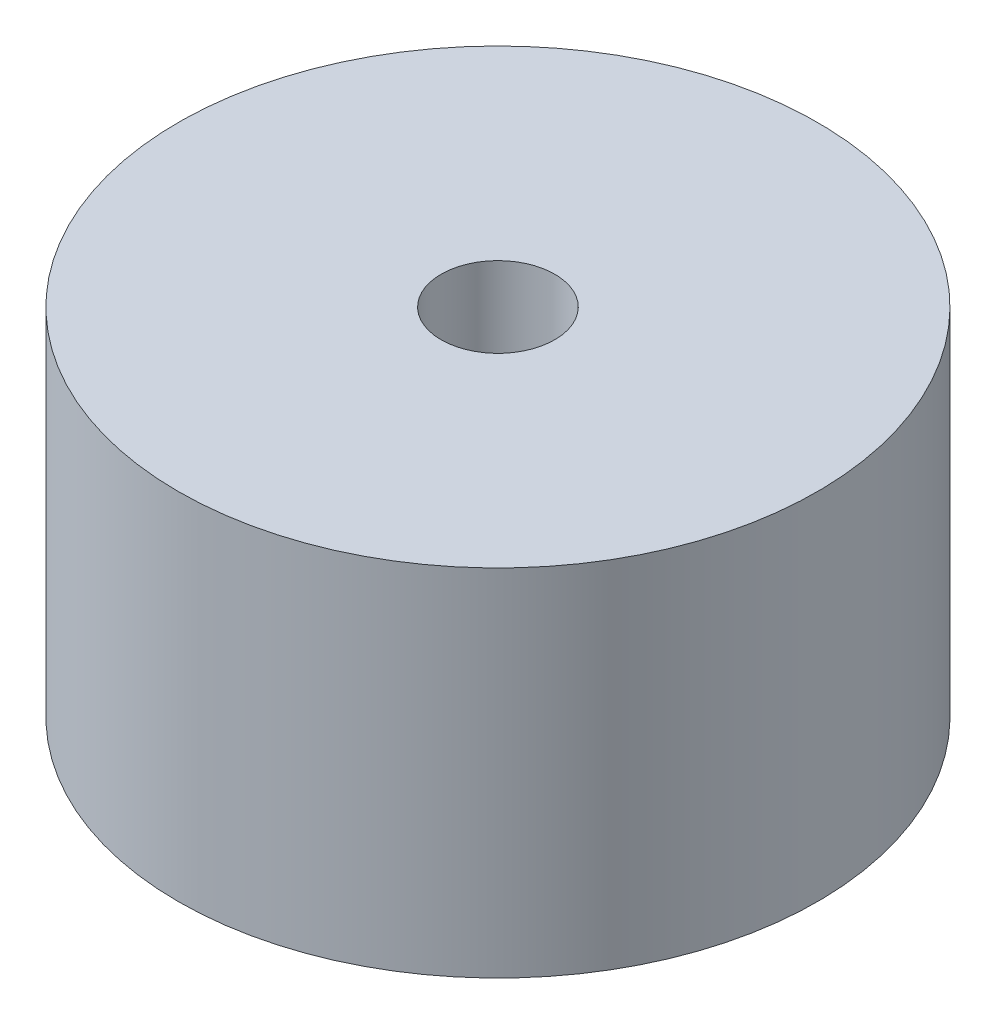
ISO-10303-21;
HEADER;
FILE_DESCRIPTION(('STEP AP214'),'2;1');
FILE_NAME('part.step','',(''),(''),'','','');
FILE_SCHEMA(('AUTOMOTIVE_DESIGN { 1 0 10303 214 1 1 1 1 }'));
ENDSEC;
DATA;
#1=APPLICATION_CONTEXT('core data for automotive mechanical design processes');
#2=APPLICATION_PROTOCOL_DEFINITION('international standard','automotive_design',2000,#1);
#3=PRODUCT_CONTEXT('',#1,'mechanical');
#4=PRODUCT('Part','Part','',(#3));
#5=PRODUCT_RELATED_PRODUCT_CATEGORY('part','',(#4));
#6=PRODUCT_DEFINITION_FORMATION('','',#4);
#7=PRODUCT_DEFINITION_CONTEXT('part definition',#1,'design');
#8=PRODUCT_DEFINITION('design','',#6,#7);
#9=PRODUCT_DEFINITION_SHAPE('','',#8);
#10=(LENGTH_UNIT() NAMED_UNIT(*) SI_UNIT(.MILLI.,.METRE.));
#11=(NAMED_UNIT(*) PLANE_ANGLE_UNIT() SI_UNIT($,.RADIAN.));
#12=(NAMED_UNIT(*) SI_UNIT($,.STERADIAN.) SOLID_ANGLE_UNIT());
#13=UNCERTAINTY_MEASURE_WITH_UNIT(LENGTH_MEASURE(1.E-05),#10,'distance_accuracy_value','');
#14=(GEOMETRIC_REPRESENTATION_CONTEXT(3) GLOBAL_UNCERTAINTY_ASSIGNED_CONTEXT((#13)) GLOBAL_UNIT_ASSIGNED_CONTEXT((#10,
#11,#12)) REPRESENTATION_CONTEXT('',''));
#15=CARTESIAN_POINT('',(0.,0.,0.));
#16=DIRECTION('',(0.,0.,1.));
#17=DIRECTION('',(1.,0.,0.));
#18=AXIS2_PLACEMENT_3D('',#15,#16,#17);
#19=CARTESIAN_POINT('',(0.,0.,0.));
#20=DIRECTION('',(0.,1.,0.));
#21=DIRECTION('',(0.,0.,1.));
#22=AXIS2_PLACEMENT_3D('',#19,#20,#21);
#23=PLANE('',#22);
#24=CARTESIAN_POINT('',(0.,0.,0.));
#25=DIRECTION('',(0.,1.,0.));
#26=DIRECTION('',(0.,0.,1.));
#27=AXIS2_PLACEMENT_3D('',#24,#25,#26);
#28=CIRCLE('',#27,22.5);
#29=CARTESIAN_POINT('',(0.,0.,22.5));
#30=VERTEX_POINT('',#29);
#31=EDGE_CURVE('E49',#30,#30,#28,.T.);
#32=ORIENTED_EDGE('',*,*,#31,.F.);
#33=EDGE_LOOP('',(#32));
#34=FACE_BOUND('',#33,.T.);
#35=CARTESIAN_POINT('',(15.5085402628159,0.,-8.10772341145277));
#36=DIRECTION('',(0.,1.,0.));
#37=DIRECTION('',(0.886202300732335,0.,-0.463298480654444));
#38=AXIS2_PLACEMENT_3D('',#35,#36,#37);
#39=CIRCLE('',#38,2.5);
#40=CARTESIAN_POINT('',(16.9017740970999,0.,-6.03193452936328));
#41=VERTEX_POINT('',#40);
#42=CARTESIAN_POINT('',(14.5991324635722,0.,-10.436452132166));
#43=VERTEX_POINT('',#42);
#44=EDGE_CURVE('E57',#41,#43,#39,.T.);
#45=ORIENTED_EDGE('',*,*,#44,.T.);
#46=DIRECTION('',(-0.931491488285303,0.,0.363763119697463));
#47=VECTOR('',#46,1.);
#48=CARTESIAN_POINT('',(3.93215186927673,0.,-6.27081649562788));
#49=LINE('',#48,#47);
#50=CARTESIAN_POINT('',(3.93215186927673,0.,-6.27081649562788));
#51=VERTEX_POINT('',#50);
#52=EDGE_CURVE('E194',#43,#51,#49,.T.);
#53=ORIENTED_EDGE('',*,*,#52,.T.);
#54=CARTESIAN_POINT('',(2.84086251018434,0.,-9.06529096048379));
#55=DIRECTION('',(0.,-1.,0.));
#56=DIRECTION('',(-0.886202300732335,0.,0.463298480654444));
#57=AXIS2_PLACEMENT_3D('',#54,#55,#56);
#58=CIRCLE('',#57,3.);
#59=CARTESIAN_POINT('',(0.349915851676953,0.,-7.39341035934299));
#60=VERTEX_POINT('',#59);
#61=EDGE_CURVE('E199',#51,#60,#58,.T.);
#62=ORIENTED_EDGE('',*,*,#61,.T.);
#63=DIRECTION('',(-0.557293533713597,0.,-0.830315552835795));
#64=VECTOR('',#63,1.);
#65=CARTESIAN_POINT('',(-6.03193452936328,0.,-16.9017740970999));
#66=LINE('',#65,#64);
#67=CARTESIAN_POINT('',(-6.03193452936328,0.,-16.9017740970999));
#68=VERTEX_POINT('',#67);
#69=EDGE_CURVE('E203',#60,#68,#66,.T.);
#70=ORIENTED_EDGE('',*,*,#69,.T.);
#71=CARTESIAN_POINT('',(-8.10772341145277,0.,-15.5085402628159));
#72=DIRECTION('',(0.,1.,0.));
#73=DIRECTION('',(0.886202300732335,0.,-0.463298480654444));
#74=AXIS2_PLACEMENT_3D('',#71,#72,#73);
#75=CIRCLE('',#74,2.5);
#76=CARTESIAN_POINT('',(-10.436452132166,0.,-14.5991324635722));
#77=VERTEX_POINT('',#76);
#78=EDGE_CURVE('E207',#68,#77,#75,.T.);
#79=ORIENTED_EDGE('',*,*,#78,.T.);
#80=DIRECTION('',(0.363763119697463,0.,0.931491488285303));
#81=VECTOR('',#80,1.);
#82=CARTESIAN_POINT('',(-6.27081649562788,0.,-3.93215186927672));
#83=LINE('',#82,#81);
#84=CARTESIAN_POINT('',(-6.27081649562788,0.,-3.93215186927672));
#85=VERTEX_POINT('',#84);
#86=EDGE_CURVE('E211',#77,#85,#83,.T.);
#87=ORIENTED_EDGE('',*,*,#86,.T.);
#88=CARTESIAN_POINT('',(-9.06529096048379,0.,-2.84086251018434));
#89=DIRECTION('',(0.,-1.,0.));
#90=DIRECTION('',(-0.886202300732335,0.,0.463298480654444));
#91=AXIS2_PLACEMENT_3D('',#88,#89,#90);
#92=CIRCLE('',#91,3.);
#93=CARTESIAN_POINT('',(-7.393410359343,0.,-0.349915851676952));
#94=VERTEX_POINT('',#93);
#95=EDGE_CURVE('E215',#85,#94,#92,.T.);
#96=ORIENTED_EDGE('',*,*,#95,.T.);
#97=DIRECTION('',(-0.830315552835795,0.,0.557293533713597));
#98=VECTOR('',#97,1.);
#99=CARTESIAN_POINT('',(-16.9017740970999,0.,6.03193452936328));
#100=LINE('',#99,#98);
#101=CARTESIAN_POINT('',(-16.9017740970999,0.,6.03193452936328));
#102=VERTEX_POINT('',#101);
#103=EDGE_CURVE('E219',#94,#102,#100,.T.);
#104=ORIENTED_EDGE('',*,*,#103,.T.);
#105=CARTESIAN_POINT('',(-15.5085402628159,0.,8.10772341145277));
#106=DIRECTION('',(0.,1.,0.));
#107=DIRECTION('',(0.886202300732335,0.,-0.463298480654444));
#108=AXIS2_PLACEMENT_3D('',#105,#106,#107);
#109=CIRCLE('',#108,2.5);
#110=CARTESIAN_POINT('',(-14.5991324635722,0.,10.436452132166));
#111=VERTEX_POINT('',#110);
#112=EDGE_CURVE('E223',#102,#111,#109,.T.);
#113=ORIENTED_EDGE('',*,*,#112,.T.);
#114=DIRECTION('',(0.931491488285303,0.,-0.363763119697463));
#115=VECTOR('',#114,1.);
#116=CARTESIAN_POINT('',(-3.93215186927673,0.,6.27081649562788));
#117=LINE('',#116,#115);
#118=CARTESIAN_POINT('',(-3.93215186927673,0.,6.27081649562788));
#119=VERTEX_POINT('',#118);
#120=EDGE_CURVE('E227',#111,#119,#117,.T.);
#121=ORIENTED_EDGE('',*,*,#120,.T.);
#122=CARTESIAN_POINT('',(-2.84086251018434,0.,9.06529096048379));
#123=DIRECTION('',(0.,-1.,0.));
#124=DIRECTION('',(-0.886202300732335,0.,0.463298480654444));
#125=AXIS2_PLACEMENT_3D('',#122,#123,#124);
#126=CIRCLE('',#125,3.);
#127=CARTESIAN_POINT('',(-0.349915851676953,0.,7.393410359343));
#128=VERTEX_POINT('',#127);
#129=EDGE_CURVE('E231',#119,#128,#126,.T.);
#130=ORIENTED_EDGE('',*,*,#129,.T.);
#131=DIRECTION('',(0.557293533713597,0.,0.830315552835795));
#132=VECTOR('',#131,1.);
#133=CARTESIAN_POINT('',(6.03193452936328,0.,16.9017740970999));
#134=LINE('',#133,#132);
#135=CARTESIAN_POINT('',(6.03193452936328,0.,16.9017740970999));
#136=VERTEX_POINT('',#135);
#137=EDGE_CURVE('E235',#128,#136,#134,.T.);
#138=ORIENTED_EDGE('',*,*,#137,.T.);
#139=CARTESIAN_POINT('',(8.10772341145277,0.,15.5085402628159));
#140=DIRECTION('',(0.,1.,0.));
#141=DIRECTION('',(0.886202300732335,0.,-0.463298480654444));
#142=AXIS2_PLACEMENT_3D('',#139,#140,#141);
#143=CIRCLE('',#142,2.5);
#144=CARTESIAN_POINT('',(10.436452132166,0.,14.5991324635722));
#145=VERTEX_POINT('',#144);
#146=EDGE_CURVE('E239',#136,#145,#143,.T.);
#147=ORIENTED_EDGE('',*,*,#146,.T.);
#148=DIRECTION('',(-0.363763119697463,0.,-0.931491488285303));
#149=VECTOR('',#148,1.);
#150=CARTESIAN_POINT('',(6.27081649562788,0.,3.93215186927673));
#151=LINE('',#150,#149);
#152=CARTESIAN_POINT('',(6.27081649562788,0.,3.93215186927673));
#153=VERTEX_POINT('',#152);
#154=EDGE_CURVE('E243',#145,#153,#151,.T.);
#155=ORIENTED_EDGE('',*,*,#154,.T.);
#156=CARTESIAN_POINT('',(9.06529096048379,0.,2.84086251018435));
#157=DIRECTION('',(0.,-1.,0.));
#158=DIRECTION('',(-0.886202300732335,0.,0.463298480654444));
#159=AXIS2_PLACEMENT_3D('',#156,#157,#158);
#160=CIRCLE('',#159,3.);
#161=CARTESIAN_POINT('',(7.393410359343,0.,0.349915851676955));
#162=VERTEX_POINT('',#161);
#163=EDGE_CURVE('E180',#153,#162,#160,.T.);
#164=ORIENTED_EDGE('',*,*,#163,.T.);
#165=DIRECTION('',(0.830315552835795,0.,-0.557293533713597));
#166=VECTOR('',#165,1.);
#167=CARTESIAN_POINT('',(16.9017740970999,0.,-6.03193452936328));
#168=LINE('',#167,#166);
#169=EDGE_CURVE('E248',#162,#41,#168,.T.);
#170=ORIENTED_EDGE('',*,*,#169,.T.);
#171=EDGE_LOOP('',(#45,#53,#62,#70,#79,#87,#96,#104,#113,#121,#130,#138,#147,#155,#164,#170));
#172=FACE_BOUND('',#171,.T.);
#173=ADVANCED_FACE('F39',(#34,#172),#23,.F.);
#174=CARTESIAN_POINT('',(0.,25.,0.));
#175=DIRECTION('',(0.,1.,0.));
#176=DIRECTION('',(0.,0.,1.));
#177=AXIS2_PLACEMENT_3D('',#174,#175,#176);
#178=PLANE('',#177);
#179=CARTESIAN_POINT('',(0.,25.,0.));
#180=DIRECTION('',(0.,1.,0.));
#181=DIRECTION('',(0.,0.,1.));
#182=AXIS2_PLACEMENT_3D('',#179,#180,#181);
#183=CIRCLE('',#182,22.5);
#184=CARTESIAN_POINT('',(0.,25.,22.5));
#185=VERTEX_POINT('',#184);
#186=EDGE_CURVE('E11',#185,#185,#183,.T.);
#187=ORIENTED_EDGE('',*,*,#186,.T.);
#188=EDGE_LOOP('',(#187));
#189=FACE_BOUND('',#188,.T.);
#190=CARTESIAN_POINT('',(0.,25.,0.));
#191=DIRECTION('',(0.,1.,0.));
#192=DIRECTION('',(0.,0.,1.));
#193=AXIS2_PLACEMENT_3D('',#190,#191,#192);
#194=CIRCLE('',#193,4.);
#195=CARTESIAN_POINT('',(0.,25.,4.));
#196=VERTEX_POINT('',#195);
#197=EDGE_CURVE('E296',#196,#196,#194,.T.);
#198=ORIENTED_EDGE('',*,*,#197,.F.);
#199=EDGE_LOOP('',(#198));
#200=FACE_BOUND('',#199,.T.);
#201=ADVANCED_FACE('F306',(#189,#200),#178,.T.);
#202=CARTESIAN_POINT('',(0.,25.,0.));
#203=DIRECTION('',(0.,-1.,0.));
#204=DIRECTION('',(0.,0.,-1.));
#205=AXIS2_PLACEMENT_3D('',#202,#203,#204);
#206=CYLINDRICAL_SURFACE('',#205,22.5);
#207=ORIENTED_EDGE('',*,*,#186,.F.);
#208=EDGE_LOOP('',(#207));
#209=FACE_BOUND('',#208,.T.);
#210=ORIENTED_EDGE('',*,*,#31,.T.);
#211=EDGE_LOOP('',(#210));
#212=FACE_BOUND('',#211,.T.);
#213=ADVANCED_FACE('F41',(#209,#212),#206,.T.);
#214=CARTESIAN_POINT('',(0.,25.,0.));
#215=DIRECTION('',(0.,-1.,0.));
#216=DIRECTION('',(0.,0.,-1.));
#217=AXIS2_PLACEMENT_3D('',#214,#215,#216);
#218=CYLINDRICAL_SURFACE('',#217,4.);
#219=CARTESIAN_POINT('',(0.,6.5,0.));
#220=DIRECTION('',(0.,1.,0.));
#221=DIRECTION('',(0.,0.,1.));
#222=AXIS2_PLACEMENT_3D('',#219,#220,#221);
#223=CIRCLE('',#222,4.);
#224=CARTESIAN_POINT('',(0.,6.5,4.));
#225=VERTEX_POINT('',#224);
#226=EDGE_CURVE('E43',#225,#225,#223,.T.);
#227=ORIENTED_EDGE('',*,*,#226,.F.);
#228=EDGE_LOOP('',(#227));
#229=FACE_BOUND('',#228,.T.);
#230=ORIENTED_EDGE('',*,*,#197,.T.);
#231=EDGE_LOOP('',(#230));
#232=FACE_BOUND('',#231,.T.);
#233=ADVANCED_FACE('F409',(#229,#232),#218,.F.);
#234=CARTESIAN_POINT('',(15.5085402628159,3.,-8.10772341145277));
#235=DIRECTION('',(0.,-1.,0.));
#236=DIRECTION('',(0.886202300732335,0.,-0.463298480654444));
#237=AXIS2_PLACEMENT_3D('',#234,#235,#236);
#238=CYLINDRICAL_SURFACE('',#237,2.5);
#239=ORIENTED_EDGE('',*,*,#44,.F.);
#240=DIRECTION('',(0.,-1.,0.));
#241=VECTOR('',#240,1.);
#242=CARTESIAN_POINT('',(16.9017740970999,3.,-6.03193452936328));
#243=LINE('',#242,#241);
#244=CARTESIAN_POINT('',(16.9017740970999,3.,-6.03193452936328));
#245=VERTEX_POINT('',#244);
#246=EDGE_CURVE('E188',#245,#41,#243,.T.);
#247=ORIENTED_EDGE('',*,*,#246,.F.);
#248=CARTESIAN_POINT('',(15.5085402628159,3.,-8.10772341145277));
#249=DIRECTION('',(0.,1.,0.));
#250=DIRECTION('',(0.886202300732335,0.,-0.463298480654444));
#251=AXIS2_PLACEMENT_3D('',#248,#249,#250);
#252=CIRCLE('',#251,2.5);
#253=CARTESIAN_POINT('',(14.5991324635722,3.,-10.436452132166));
#254=VERTEX_POINT('',#253);
#255=EDGE_CURVE('E252',#245,#254,#252,.T.);
#256=ORIENTED_EDGE('',*,*,#255,.T.);
#257=DIRECTION('',(0.,-1.,0.));
#258=VECTOR('',#257,1.);
#259=CARTESIAN_POINT('',(14.5991324635722,3.,-10.436452132166));
#260=LINE('',#259,#258);
#261=EDGE_CURVE('E292',#254,#43,#260,.T.);
#262=ORIENTED_EDGE('',*,*,#261,.T.);
#263=EDGE_LOOP('',(#239,#247,#256,#262));
#264=FACE_BOUND('',#263,.T.);
#265=ADVANCED_FACE('F308',(#264),#238,.F.);
#266=CARTESIAN_POINT('',(3.93215186927673,3.,-6.27081649562788));
#267=DIRECTION('',(0.363763119697463,0.,0.931491488285303));
#268=DIRECTION('',(0.931491488285304,0.,-0.363763119697463));
#269=AXIS2_PLACEMENT_3D('',#266,#267,#268);
#270=PLANE('',#269);
#271=ORIENTED_EDGE('',*,*,#52,.F.);
#272=ORIENTED_EDGE('',*,*,#261,.F.);
#273=DIRECTION('',(-0.931491488285303,0.,0.363763119697463));
#274=VECTOR('',#273,1.);
#275=CARTESIAN_POINT('',(3.93215186927673,3.,-6.27081649562788));
#276=LINE('',#275,#274);
#277=CARTESIAN_POINT('',(3.93215186927673,3.,-6.27081649562788));
#278=VERTEX_POINT('',#277);
#279=EDGE_CURVE('E126',#254,#278,#276,.T.);
#280=ORIENTED_EDGE('',*,*,#279,.T.);
#281=DIRECTION('',(0.,-1.,0.));
#282=VECTOR('',#281,1.);
#283=CARTESIAN_POINT('',(3.93215186927673,3.,-6.27081649562788));
#284=LINE('',#283,#282);
#285=EDGE_CURVE('E289',#278,#51,#284,.T.);
#286=ORIENTED_EDGE('',*,*,#285,.T.);
#287=EDGE_LOOP('',(#271,#272,#280,#286));
#288=FACE_BOUND('',#287,.T.);
#289=ADVANCED_FACE('F401',(#288),#270,.T.);
#290=CARTESIAN_POINT('',(2.84086251018434,3.,-9.06529096048379));
#291=DIRECTION('',(0.,-1.,0.));
#292=DIRECTION('',(0.886202300732335,0.,-0.463298480654444));
#293=AXIS2_PLACEMENT_3D('',#290,#291,#292);
#294=CYLINDRICAL_SURFACE('',#293,3.);
#295=ORIENTED_EDGE('',*,*,#61,.F.);
#296=ORIENTED_EDGE('',*,*,#285,.F.);
#297=CARTESIAN_POINT('',(2.84086251018434,3.,-9.06529096048379));
#298=DIRECTION('',(0.,-1.,0.));
#299=DIRECTION('',(-0.886202300732335,0.,0.463298480654444));
#300=AXIS2_PLACEMENT_3D('',#297,#298,#299);
#301=CIRCLE('',#300,3.);
#302=CARTESIAN_POINT('',(0.349915851676953,3.,-7.39341035934299));
#303=VERTEX_POINT('',#302);
#304=EDGE_CURVE('E313',#278,#303,#301,.T.);
#305=ORIENTED_EDGE('',*,*,#304,.T.);
#306=DIRECTION('',(0.,-1.,0.));
#307=VECTOR('',#306,1.);
#308=CARTESIAN_POINT('',(0.349915851676953,3.,-7.39341035934299));
#309=LINE('',#308,#307);
#310=EDGE_CURVE('E286',#303,#60,#309,.T.);
#311=ORIENTED_EDGE('',*,*,#310,.T.);
#312=EDGE_LOOP('',(#295,#296,#305,#311));
#313=FACE_BOUND('',#312,.T.);
#314=ADVANCED_FACE('F399',(#313),#294,.T.);
#315=CARTESIAN_POINT('',(-6.03193452936328,3.,-16.9017740970999));
#316=DIRECTION('',(-0.830315552835795,0.,0.557293533713597));
#317=DIRECTION('',(0.557293533713598,0.,0.830315552835795));
#318=AXIS2_PLACEMENT_3D('',#315,#316,#317);
#319=PLANE('',#318);
#320=ORIENTED_EDGE('',*,*,#69,.F.);
#321=ORIENTED_EDGE('',*,*,#310,.F.);
#322=DIRECTION('',(-0.557293533713597,0.,-0.830315552835795));
#323=VECTOR('',#322,1.);
#324=CARTESIAN_POINT('',(-6.03193452936328,3.,-16.9017740970999));
#325=LINE('',#324,#323);
#326=CARTESIAN_POINT('',(-6.03193452936328,3.,-16.9017740970999));
#327=VERTEX_POINT('',#326);
#328=EDGE_CURVE('E320',#303,#327,#325,.T.);
#329=ORIENTED_EDGE('',*,*,#328,.T.);
#330=DIRECTION('',(0.,-1.,0.));
#331=VECTOR('',#330,1.);
#332=CARTESIAN_POINT('',(-6.03193452936328,3.,-16.9017740970999));
#333=LINE('',#332,#331);
#334=EDGE_CURVE('E283',#327,#68,#333,.T.);
#335=ORIENTED_EDGE('',*,*,#334,.T.);
#336=EDGE_LOOP('',(#320,#321,#329,#335));
#337=FACE_BOUND('',#336,.T.);
#338=ADVANCED_FACE('F394',(#337),#319,.T.);
#339=CARTESIAN_POINT('',(-8.10772341145277,3.,-15.5085402628159));
#340=DIRECTION('',(0.,-1.,0.));
#341=DIRECTION('',(0.886202300732335,0.,-0.463298480654444));
#342=AXIS2_PLACEMENT_3D('',#339,#340,#341);
#343=CYLINDRICAL_SURFACE('',#342,2.5);
#344=ORIENTED_EDGE('',*,*,#78,.F.);
#345=ORIENTED_EDGE('',*,*,#334,.F.);
#346=CARTESIAN_POINT('',(-8.10772341145277,3.,-15.5085402628159));
#347=DIRECTION('',(0.,1.,0.));
#348=DIRECTION('',(0.886202300732335,0.,-0.463298480654444));
#349=AXIS2_PLACEMENT_3D('',#346,#347,#348);
#350=CIRCLE('',#349,2.5);
#351=CARTESIAN_POINT('',(-10.436452132166,3.,-14.5991324635722));
#352=VERTEX_POINT('',#351);
#353=EDGE_CURVE('E323',#327,#352,#350,.T.);
#354=ORIENTED_EDGE('',*,*,#353,.T.);
#355=DIRECTION('',(0.,-1.,0.));
#356=VECTOR('',#355,1.);
#357=CARTESIAN_POINT('',(-10.436452132166,3.,-14.5991324635722));
#358=LINE('',#357,#356);
#359=EDGE_CURVE('E280',#352,#77,#358,.T.);
#360=ORIENTED_EDGE('',*,*,#359,.T.);
#361=EDGE_LOOP('',(#344,#345,#354,#360));
#362=FACE_BOUND('',#361,.T.);
#363=ADVANCED_FACE('F390',(#362),#343,.F.);
#364=CARTESIAN_POINT('',(-6.27081649562788,3.,-3.93215186927672));
#365=DIRECTION('',(0.931491488285303,0.,-0.363763119697463));
#366=DIRECTION('',(-0.363763119697463,0.,-0.931491488285303));
#367=AXIS2_PLACEMENT_3D('',#364,#365,#366);
#368=PLANE('',#367);
#369=ORIENTED_EDGE('',*,*,#86,.F.);
#370=ORIENTED_EDGE('',*,*,#359,.F.);
#371=DIRECTION('',(0.363763119697463,0.,0.931491488285303));
#372=VECTOR('',#371,1.);
#373=CARTESIAN_POINT('',(-6.27081649562788,3.,-3.93215186927672));
#374=LINE('',#373,#372);
#375=CARTESIAN_POINT('',(-6.27081649562788,3.,-3.93215186927672));
#376=VERTEX_POINT('',#375);
#377=EDGE_CURVE('E326',#352,#376,#374,.T.);
#378=ORIENTED_EDGE('',*,*,#377,.T.);
#379=DIRECTION('',(0.,-1.,0.));
#380=VECTOR('',#379,1.);
#381=CARTESIAN_POINT('',(-6.27081649562788,3.,-3.93215186927672));
#382=LINE('',#381,#380);
#383=EDGE_CURVE('E277',#376,#85,#382,.T.);
#384=ORIENTED_EDGE('',*,*,#383,.T.);
#385=EDGE_LOOP('',(#369,#370,#378,#384));
#386=FACE_BOUND('',#385,.T.);
#387=ADVANCED_FACE('F387',(#386),#368,.T.);
#388=CARTESIAN_POINT('',(-9.06529096048379,3.,-2.84086251018434));
#389=DIRECTION('',(0.,-1.,0.));
#390=DIRECTION('',(0.886202300732335,0.,-0.463298480654444));
#391=AXIS2_PLACEMENT_3D('',#388,#389,#390);
#392=CYLINDRICAL_SURFACE('',#391,3.);
#393=ORIENTED_EDGE('',*,*,#95,.F.);
#394=ORIENTED_EDGE('',*,*,#383,.F.);
#395=CARTESIAN_POINT('',(-9.06529096048379,3.,-2.84086251018434));
#396=DIRECTION('',(0.,-1.,0.));
#397=DIRECTION('',(-0.886202300732335,0.,0.463298480654444));
#398=AXIS2_PLACEMENT_3D('',#395,#396,#397);
#399=CIRCLE('',#398,3.);
#400=CARTESIAN_POINT('',(-7.393410359343,3.,-0.349915851676952));
#401=VERTEX_POINT('',#400);
#402=EDGE_CURVE('E329',#376,#401,#399,.T.);
#403=ORIENTED_EDGE('',*,*,#402,.T.);
#404=DIRECTION('',(0.,-1.,0.));
#405=VECTOR('',#404,1.);
#406=CARTESIAN_POINT('',(-7.393410359343,3.,-0.349915851676952));
#407=LINE('',#406,#405);
#408=EDGE_CURVE('E274',#401,#94,#407,.T.);
#409=ORIENTED_EDGE('',*,*,#408,.T.);
#410=EDGE_LOOP('',(#393,#394,#403,#409));
#411=FACE_BOUND('',#410,.T.);
#412=ADVANCED_FACE('F379',(#411),#392,.T.);
#413=CARTESIAN_POINT('',(-16.9017740970999,3.,6.03193452936328));
#414=DIRECTION('',(0.557293533713597,0.,0.830315552835795));
#415=DIRECTION('',(0.830315552835795,0.,-0.557293533713597));
#416=AXIS2_PLACEMENT_3D('',#413,#414,#415);
#417=PLANE('',#416);
#418=ORIENTED_EDGE('',*,*,#103,.F.);
#419=ORIENTED_EDGE('',*,*,#408,.F.);
#420=DIRECTION('',(-0.830315552835795,0.,0.557293533713597));
#421=VECTOR('',#420,1.);
#422=CARTESIAN_POINT('',(-16.9017740970999,3.,6.03193452936328));
#423=LINE('',#422,#421);
#424=CARTESIAN_POINT('',(-16.9017740970999,3.,6.03193452936328));
#425=VERTEX_POINT('',#424);
#426=EDGE_CURVE('E332',#401,#425,#423,.T.);
#427=ORIENTED_EDGE('',*,*,#426,.T.);
#428=DIRECTION('',(0.,-1.,0.));
#429=VECTOR('',#428,1.);
#430=CARTESIAN_POINT('',(-16.9017740970999,3.,6.03193452936328));
#431=LINE('',#430,#429);
#432=EDGE_CURVE('E271',#425,#102,#431,.T.);
#433=ORIENTED_EDGE('',*,*,#432,.T.);
#434=EDGE_LOOP('',(#418,#419,#427,#433));
#435=FACE_BOUND('',#434,.T.);
#436=ADVANCED_FACE('F375',(#435),#417,.T.);
#437=CARTESIAN_POINT('',(-15.5085402628159,3.,8.10772341145277));
#438=DIRECTION('',(0.,-1.,0.));
#439=DIRECTION('',(0.886202300732335,0.,-0.463298480654444));
#440=AXIS2_PLACEMENT_3D('',#437,#438,#439);
#441=CYLINDRICAL_SURFACE('',#440,2.5);
#442=ORIENTED_EDGE('',*,*,#112,.F.);
#443=ORIENTED_EDGE('',*,*,#432,.F.);
#444=CARTESIAN_POINT('',(-15.5085402628159,3.,8.10772341145277));
#445=DIRECTION('',(0.,1.,0.));
#446=DIRECTION('',(0.886202300732335,0.,-0.463298480654444));
#447=AXIS2_PLACEMENT_3D('',#444,#445,#446);
#448=CIRCLE('',#447,2.5);
#449=CARTESIAN_POINT('',(-14.5991324635722,3.,10.436452132166));
#450=VERTEX_POINT('',#449);
#451=EDGE_CURVE('E335',#425,#450,#448,.T.);
#452=ORIENTED_EDGE('',*,*,#451,.T.);
#453=DIRECTION('',(0.,-1.,0.));
#454=VECTOR('',#453,1.);
#455=CARTESIAN_POINT('',(-14.5991324635722,3.,10.436452132166));
#456=LINE('',#455,#454);
#457=EDGE_CURVE('E268',#450,#111,#456,.T.);
#458=ORIENTED_EDGE('',*,*,#457,.T.);
#459=EDGE_LOOP('',(#442,#443,#452,#458));
#460=FACE_BOUND('',#459,.T.);
#461=ADVANCED_FACE('F372',(#460),#441,.F.);
#462=CARTESIAN_POINT('',(-3.93215186927673,3.,6.27081649562788));
#463=DIRECTION('',(-0.363763119697463,0.,-0.931491488285303));
#464=DIRECTION('',(-0.931491488285303,0.,0.363763119697463));
#465=AXIS2_PLACEMENT_3D('',#462,#463,#464);
#466=PLANE('',#465);
#467=ORIENTED_EDGE('',*,*,#120,.F.);
#468=ORIENTED_EDGE('',*,*,#457,.F.);
#469=DIRECTION('',(0.931491488285303,0.,-0.363763119697463));
#470=VECTOR('',#469,1.);
#471=CARTESIAN_POINT('',(-3.93215186927673,3.,6.27081649562788));
#472=LINE('',#471,#470);
#473=CARTESIAN_POINT('',(-3.93215186927673,3.,6.27081649562788));
#474=VERTEX_POINT('',#473);
#475=EDGE_CURVE('E338',#450,#474,#472,.T.);
#476=ORIENTED_EDGE('',*,*,#475,.T.);
#477=DIRECTION('',(0.,-1.,0.));
#478=VECTOR('',#477,1.);
#479=CARTESIAN_POINT('',(-3.93215186927673,3.,6.27081649562788));
#480=LINE('',#479,#478);
#481=EDGE_CURVE('E265',#474,#119,#480,.T.);
#482=ORIENTED_EDGE('',*,*,#481,.T.);
#483=EDGE_LOOP('',(#467,#468,#476,#482));
#484=FACE_BOUND('',#483,.T.);
#485=ADVANCED_FACE('F364',(#484),#466,.T.);
#486=CARTESIAN_POINT('',(-2.84086251018434,3.,9.06529096048379));
#487=DIRECTION('',(0.,-1.,0.));
#488=DIRECTION('',(0.886202300732335,0.,-0.463298480654444));
#489=AXIS2_PLACEMENT_3D('',#486,#487,#488);
#490=CYLINDRICAL_SURFACE('',#489,3.);
#491=ORIENTED_EDGE('',*,*,#129,.F.);
#492=ORIENTED_EDGE('',*,*,#481,.F.);
#493=CARTESIAN_POINT('',(-2.84086251018434,3.,9.06529096048379));
#494=DIRECTION('',(0.,-1.,0.));
#495=DIRECTION('',(-0.886202300732335,0.,0.463298480654444));
#496=AXIS2_PLACEMENT_3D('',#493,#494,#495);
#497=CIRCLE('',#496,3.);
#498=CARTESIAN_POINT('',(-0.349915851676953,3.,7.393410359343));
#499=VERTEX_POINT('',#498);
#500=EDGE_CURVE('E341',#474,#499,#497,.T.);
#501=ORIENTED_EDGE('',*,*,#500,.T.);
#502=DIRECTION('',(0.,-1.,0.));
#503=VECTOR('',#502,1.);
#504=CARTESIAN_POINT('',(-0.349915851676953,3.,7.393410359343));
#505=LINE('',#504,#503);
#506=EDGE_CURVE('E262',#499,#128,#505,.T.);
#507=ORIENTED_EDGE('',*,*,#506,.T.);
#508=EDGE_LOOP('',(#491,#492,#501,#507));
#509=FACE_BOUND('',#508,.T.);
#510=ADVANCED_FACE('F360',(#509),#490,.T.);
#511=CARTESIAN_POINT('',(6.03193452936328,3.,16.9017740970999));
#512=DIRECTION('',(0.830315552835795,0.,-0.557293533713597));
#513=DIRECTION('',(-0.557293533713597,0.,-0.830315552835795));
#514=AXIS2_PLACEMENT_3D('',#511,#512,#513);
#515=PLANE('',#514);
#516=ORIENTED_EDGE('',*,*,#137,.F.);
#517=ORIENTED_EDGE('',*,*,#506,.F.);
#518=DIRECTION('',(0.557293533713597,0.,0.830315552835795));
#519=VECTOR('',#518,1.);
#520=CARTESIAN_POINT('',(6.03193452936328,3.,16.9017740970999));
#521=LINE('',#520,#519);
#522=CARTESIAN_POINT('',(6.03193452936328,3.,16.9017740970999));
#523=VERTEX_POINT('',#522);
#524=EDGE_CURVE('E344',#499,#523,#521,.T.);
#525=ORIENTED_EDGE('',*,*,#524,.T.);
#526=DIRECTION('',(0.,-1.,0.));
#527=VECTOR('',#526,1.);
#528=CARTESIAN_POINT('',(6.03193452936328,3.,16.9017740970999));
#529=LINE('',#528,#527);
#530=EDGE_CURVE('E259',#523,#136,#529,.T.);
#531=ORIENTED_EDGE('',*,*,#530,.T.);
#532=EDGE_LOOP('',(#516,#517,#525,#531));
#533=FACE_BOUND('',#532,.T.);
#534=ADVANCED_FACE('F357',(#533),#515,.T.);
#535=CARTESIAN_POINT('',(8.10772341145277,3.,15.5085402628159));
#536=DIRECTION('',(0.,-1.,0.));
#537=DIRECTION('',(0.886202300732335,0.,-0.463298480654444));
#538=AXIS2_PLACEMENT_3D('',#535,#536,#537);
#539=CYLINDRICAL_SURFACE('',#538,2.5);
#540=ORIENTED_EDGE('',*,*,#146,.F.);
#541=ORIENTED_EDGE('',*,*,#530,.F.);
#542=CARTESIAN_POINT('',(8.10772341145277,3.,15.5085402628159));
#543=DIRECTION('',(0.,1.,0.));
#544=DIRECTION('',(0.886202300732335,0.,-0.463298480654444));
#545=AXIS2_PLACEMENT_3D('',#542,#543,#544);
#546=CIRCLE('',#545,2.5);
#547=CARTESIAN_POINT('',(10.436452132166,3.,14.5991324635722));
#548=VERTEX_POINT('',#547);
#549=EDGE_CURVE('E176',#523,#548,#546,.T.);
#550=ORIENTED_EDGE('',*,*,#549,.T.);
#551=DIRECTION('',(0.,-1.,0.));
#552=VECTOR('',#551,1.);
#553=CARTESIAN_POINT('',(10.436452132166,3.,14.5991324635722));
#554=LINE('',#553,#552);
#555=EDGE_CURVE('E171',#548,#145,#554,.T.);
#556=ORIENTED_EDGE('',*,*,#555,.T.);
#557=EDGE_LOOP('',(#540,#541,#550,#556));
#558=FACE_BOUND('',#557,.T.);
#559=ADVANCED_FACE('F350',(#558),#539,.F.);
#560=CARTESIAN_POINT('',(6.27081649562788,3.,3.93215186927673));
#561=DIRECTION('',(-0.931491488285303,0.,0.363763119697463));
#562=DIRECTION('',(0.363763119697463,0.,0.931491488285303));
#563=AXIS2_PLACEMENT_3D('',#560,#561,#562);
#564=PLANE('',#563);
#565=ORIENTED_EDGE('',*,*,#154,.F.);
#566=ORIENTED_EDGE('',*,*,#555,.F.);
#567=DIRECTION('',(-0.363763119697463,0.,-0.931491488285303));
#568=VECTOR('',#567,1.);
#569=CARTESIAN_POINT('',(6.27081649562788,3.,3.93215186927673));
#570=LINE('',#569,#568);
#571=CARTESIAN_POINT('',(6.27081649562788,3.,3.93215186927673));
#572=VERTEX_POINT('',#571);
#573=EDGE_CURVE('E166',#548,#572,#570,.T.);
#574=ORIENTED_EDGE('',*,*,#573,.T.);
#575=DIRECTION('',(0.,-1.,0.));
#576=VECTOR('',#575,1.);
#577=CARTESIAN_POINT('',(6.27081649562788,3.,3.93215186927673));
#578=LINE('',#577,#576);
#579=EDGE_CURVE('E170',#572,#153,#578,.T.);
#580=ORIENTED_EDGE('',*,*,#579,.T.);
#581=EDGE_LOOP('',(#565,#566,#574,#580));
#582=FACE_BOUND('',#581,.T.);
#583=ADVANCED_FACE('F169',(#582),#564,.T.);
#584=CARTESIAN_POINT('',(9.06529096048379,3.,2.84086251018435));
#585=DIRECTION('',(0.,-1.,0.));
#586=DIRECTION('',(0.886202300732335,0.,-0.463298480654444));
#587=AXIS2_PLACEMENT_3D('',#584,#585,#586);
#588=CYLINDRICAL_SURFACE('',#587,3.);
#589=ORIENTED_EDGE('',*,*,#163,.F.);
#590=ORIENTED_EDGE('',*,*,#579,.F.);
#591=CARTESIAN_POINT('',(9.06529096048379,3.,2.84086251018435));
#592=DIRECTION('',(0.,-1.,0.));
#593=DIRECTION('',(-0.886202300732335,0.,0.463298480654444));
#594=AXIS2_PLACEMENT_3D('',#591,#592,#593);
#595=CIRCLE('',#594,3.);
#596=CARTESIAN_POINT('',(7.393410359343,3.,0.349915851676955));
#597=VERTEX_POINT('',#596);
#598=EDGE_CURVE('E175',#572,#597,#595,.T.);
#599=ORIENTED_EDGE('',*,*,#598,.T.);
#600=DIRECTION('',(0.,-1.,0.));
#601=VECTOR('',#600,1.);
#602=CARTESIAN_POINT('',(7.393410359343,3.,0.349915851676955));
#603=LINE('',#602,#601);
#604=EDGE_CURVE('E117',#597,#162,#603,.T.);
#605=ORIENTED_EDGE('',*,*,#604,.T.);
#606=EDGE_LOOP('',(#589,#590,#599,#605));
#607=FACE_BOUND('',#606,.T.);
#608=ADVANCED_FACE('F178',(#607),#588,.T.);
#609=CARTESIAN_POINT('',(16.9017740970999,3.,-6.03193452936328));
#610=DIRECTION('',(-0.557293533713597,0.,-0.830315552835795));
#611=DIRECTION('',(-0.830315552835795,0.,0.557293533713597));
#612=AXIS2_PLACEMENT_3D('',#609,#610,#611);
#613=PLANE('',#612);
#614=ORIENTED_EDGE('',*,*,#169,.F.);
#615=ORIENTED_EDGE('',*,*,#604,.F.);
#616=DIRECTION('',(0.830315552835795,0.,-0.557293533713597));
#617=VECTOR('',#616,1.);
#618=CARTESIAN_POINT('',(16.9017740970999,3.,-6.03193452936328));
#619=LINE('',#618,#617);
#620=EDGE_CURVE('E65',#597,#245,#619,.T.);
#621=ORIENTED_EDGE('',*,*,#620,.T.);
#622=ORIENTED_EDGE('',*,*,#246,.T.);
#623=EDGE_LOOP('',(#614,#615,#621,#622));
#624=FACE_BOUND('',#623,.T.);
#625=ADVANCED_FACE('F307',(#624),#613,.T.);
#626=CARTESIAN_POINT('',(15.5085402628159,3.,-8.10772341145277));
#627=DIRECTION('',(0.,-1.,0.));
#628=DIRECTION('',(0.886202300732335,0.,-0.463298480654444));
#629=AXIS2_PLACEMENT_3D('',#626,#627,#628);
#630=PLANE('',#629);
#631=CARTESIAN_POINT('',(0.,3.,0.));
#632=DIRECTION('',(0.,1.,0.));
#633=DIRECTION('',(-0.886202300732335,0.,0.463298480654444));
#634=AXIS2_PLACEMENT_3D('',#631,#632,#633);
#635=CIRCLE('',#634,4.8);
#636=CARTESIAN_POINT('',(-4.25377104351521,3.,2.22383270714133));
#637=VERTEX_POINT('',#636);
#638=EDGE_CURVE('E295',#637,#637,#635,.T.);
#639=ORIENTED_EDGE('',*,*,#638,.T.);
#640=EDGE_LOOP('',(#639));
#641=FACE_BOUND('',#640,.T.);
#642=ORIENTED_EDGE('',*,*,#255,.F.);
#643=ORIENTED_EDGE('',*,*,#620,.F.);
#644=ORIENTED_EDGE('',*,*,#598,.F.);
#645=ORIENTED_EDGE('',*,*,#573,.F.);
#646=ORIENTED_EDGE('',*,*,#549,.F.);
#647=ORIENTED_EDGE('',*,*,#524,.F.);
#648=ORIENTED_EDGE('',*,*,#500,.F.);
#649=ORIENTED_EDGE('',*,*,#475,.F.);
#650=ORIENTED_EDGE('',*,*,#451,.F.);
#651=ORIENTED_EDGE('',*,*,#426,.F.);
#652=ORIENTED_EDGE('',*,*,#402,.F.);
#653=ORIENTED_EDGE('',*,*,#377,.F.);
#654=ORIENTED_EDGE('',*,*,#353,.F.);
#655=ORIENTED_EDGE('',*,*,#328,.F.);
#656=ORIENTED_EDGE('',*,*,#304,.F.);
#657=ORIENTED_EDGE('',*,*,#279,.F.);
#658=EDGE_LOOP('',(#642,#643,#644,#645,#646,#647,#648,#649,#650,#651,#652,#653,#654,#655,#656,#657));
#659=FACE_BOUND('',#658,.T.);
#660=ADVANCED_FACE('F184',(#641,#659),#630,.T.);
#661=CARTESIAN_POINT('',(0.,6.5,0.));
#662=DIRECTION('',(0.,1.,0.));
#663=DIRECTION('',(-0.886202300732335,0.,0.463298480654444));
#664=AXIS2_PLACEMENT_3D('',#661,#662,#663);
#665=PLANE('',#664);
#666=ORIENTED_EDGE('',*,*,#226,.T.);
#667=EDGE_LOOP('',(#666));
#668=FACE_BOUND('',#667,.T.);
#669=CARTESIAN_POINT('',(0.,6.5,0.));
#670=DIRECTION('',(0.,1.,0.));
#671=DIRECTION('',(-0.886202300732335,0.,0.463298480654444));
#672=AXIS2_PLACEMENT_3D('',#669,#670,#671);
#673=CIRCLE('',#672,4.8);
#674=CARTESIAN_POINT('',(-4.25377104351521,6.5,2.22383270714133));
#675=VERTEX_POINT('',#674);
#676=EDGE_CURVE('E195',#675,#675,#673,.T.);
#677=ORIENTED_EDGE('',*,*,#676,.F.);
#678=EDGE_LOOP('',(#677));
#679=FACE_BOUND('',#678,.T.);
#680=ADVANCED_FACE('F560',(#668,#679),#665,.F.);
#681=CARTESIAN_POINT('',(0.,6.5,0.));
#682=DIRECTION('',(0.,-1.,0.));
#683=DIRECTION('',(0.886202300732335,0.,-0.463298480654444));
#684=AXIS2_PLACEMENT_3D('',#681,#682,#683);
#685=CYLINDRICAL_SURFACE('',#684,4.8);
#686=ORIENTED_EDGE('',*,*,#676,.T.);
#687=EDGE_LOOP('',(#686));
#688=FACE_BOUND('',#687,.T.);
#689=ORIENTED_EDGE('',*,*,#638,.F.);
#690=EDGE_LOOP('',(#689));
#691=FACE_BOUND('',#690,.T.);
#692=ADVANCED_FACE('F570',(#688,#691),#685,.F.);
#693=CLOSED_SHELL('',(#173,#201,#213,#233,#265,#289,#314,#338,#363,#387,#412,#436,#461,#485,
#510,#534,#559,#583,#608,#625,#660,#680,#692));
#694=MANIFOLD_SOLID_BREP('B2',#693);
#695=ADVANCED_BREP_SHAPE_REPRESENTATION('',(#18,#694),#14);
#696=SHAPE_DEFINITION_REPRESENTATION(#9,#695);
ENDSEC;
END-ISO-10303-21;
